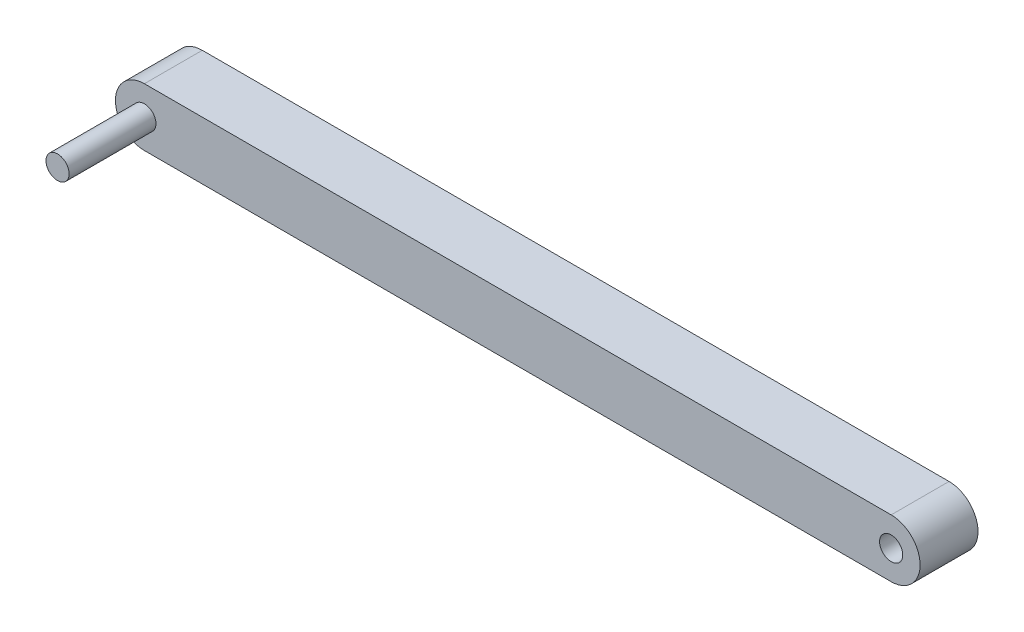
ISO-10303-21;
HEADER;
FILE_DESCRIPTION(('STEP AP214'),'2;1');
FILE_NAME('part.step','',(''),(''),'','','');
FILE_SCHEMA(('AUTOMOTIVE_DESIGN { 1 0 10303 214 1 1 1 1 }'));
ENDSEC;
DATA;
#1=APPLICATION_CONTEXT('core data for automotive mechanical design processes');
#2=APPLICATION_PROTOCOL_DEFINITION('international standard','automotive_design',2000,#1);
#3=PRODUCT_CONTEXT('',#1,'mechanical');
#4=PRODUCT('Part','Part','',(#3));
#5=PRODUCT_RELATED_PRODUCT_CATEGORY('part','',(#4));
#6=PRODUCT_DEFINITION_FORMATION('','',#4);
#7=PRODUCT_DEFINITION_CONTEXT('part definition',#1,'design');
#8=PRODUCT_DEFINITION('design','',#6,#7);
#9=PRODUCT_DEFINITION_SHAPE('','',#8);
#10=(LENGTH_UNIT() NAMED_UNIT(*) SI_UNIT(.MILLI.,.METRE.));
#11=(NAMED_UNIT(*) PLANE_ANGLE_UNIT() SI_UNIT($,.RADIAN.));
#12=(NAMED_UNIT(*) SI_UNIT($,.STERADIAN.) SOLID_ANGLE_UNIT());
#13=UNCERTAINTY_MEASURE_WITH_UNIT(LENGTH_MEASURE(1.E-05),#10,'distance_accuracy_value','');
#14=(GEOMETRIC_REPRESENTATION_CONTEXT(3) GLOBAL_UNCERTAINTY_ASSIGNED_CONTEXT((#13)) GLOBAL_UNIT_ASSIGNED_CONTEXT((#10,
#11,#12)) REPRESENTATION_CONTEXT('',''));
#15=CARTESIAN_POINT('',(0.,0.,0.));
#16=DIRECTION('',(0.,0.,1.));
#17=DIRECTION('',(1.,0.,0.));
#18=AXIS2_PLACEMENT_3D('',#15,#16,#17);
#19=CARTESIAN_POINT('',(0.,50.,100.));
#20=DIRECTION('',(0.,0.,-1.));
#21=DIRECTION('',(-1.,0.,0.));
#22=AXIS2_PLACEMENT_3D('',#19,#20,#21);
#23=CYLINDRICAL_SURFACE('',#22,50.);
#24=CARTESIAN_POINT('',(0.,50.,0.));
#25=DIRECTION('',(0.,0.,1.));
#26=DIRECTION('',(1.,0.,0.));
#27=AXIS2_PLACEMENT_3D('',#24,#25,#26);
#28=CIRCLE('',#27,50.);
#29=CARTESIAN_POINT('',(0.,0.,0.));
#30=VERTEX_POINT('',#29);
#31=CARTESIAN_POINT('',(0.,100.,0.));
#32=VERTEX_POINT('',#31);
#33=EDGE_CURVE('E108',#30,#32,#28,.F.);
#34=ORIENTED_EDGE('',*,*,#33,.F.);
#35=DIRECTION('',(0.,0.,-1.));
#36=VECTOR('',#35,1.);
#37=CARTESIAN_POINT('',(0.,0.,100.));
#38=LINE('',#37,#36);
#39=CARTESIAN_POINT('',(0.,0.,100.));
#40=VERTEX_POINT('',#39);
#41=EDGE_CURVE('E11',#40,#30,#38,.T.);
#42=ORIENTED_EDGE('',*,*,#41,.F.);
#43=CARTESIAN_POINT('',(0.,50.,100.));
#44=DIRECTION('',(0.,0.,1.));
#45=DIRECTION('',(1.,0.,0.));
#46=AXIS2_PLACEMENT_3D('',#43,#44,#45);
#47=CIRCLE('',#46,50.);
#48=CARTESIAN_POINT('',(0.,100.,100.));
#49=VERTEX_POINT('',#48);
#50=EDGE_CURVE('E92',#40,#49,#47,.F.);
#51=ORIENTED_EDGE('',*,*,#50,.T.);
#52=DIRECTION('',(0.,0.,-1.));
#53=VECTOR('',#52,1.);
#54=CARTESIAN_POINT('',(0.,100.,100.));
#55=LINE('',#54,#53);
#56=EDGE_CURVE('E81',#49,#32,#55,.T.);
#57=ORIENTED_EDGE('',*,*,#56,.T.);
#58=EDGE_LOOP('',(#34,#42,#51,#57));
#59=FACE_BOUND('',#58,.T.);
#60=ADVANCED_FACE('F41',(#59),#23,.T.);
#61=CARTESIAN_POINT('',(0.,0.,100.));
#62=DIRECTION('',(0.,1.,0.));
#63=DIRECTION('',(0.,0.,1.));
#64=AXIS2_PLACEMENT_3D('',#61,#62,#63);
#65=PLANE('',#64);
#66=DIRECTION('',(1.,0.,0.));
#67=VECTOR('',#66,1.);
#68=CARTESIAN_POINT('',(0.,0.,0.));
#69=LINE('',#68,#67);
#70=CARTESIAN_POINT('',(1290.,0.,0.));
#71=VERTEX_POINT('',#70);
#72=EDGE_CURVE('E98',#30,#71,#69,.T.);
#73=ORIENTED_EDGE('',*,*,#72,.T.);
#74=DIRECTION('',(0.,0.,-1.));
#75=VECTOR('',#74,1.);
#76=CARTESIAN_POINT('',(1290.,0.,100.));
#77=LINE('',#76,#75);
#78=CARTESIAN_POINT('',(1290.,0.,100.));
#79=VERTEX_POINT('',#78);
#80=EDGE_CURVE('E50',#79,#71,#77,.T.);
#81=ORIENTED_EDGE('',*,*,#80,.F.);
#82=DIRECTION('',(1.,0.,0.));
#83=VECTOR('',#82,1.);
#84=CARTESIAN_POINT('',(0.,0.,100.));
#85=LINE('',#84,#83);
#86=EDGE_CURVE('E87',#40,#79,#85,.T.);
#87=ORIENTED_EDGE('',*,*,#86,.F.);
#88=ORIENTED_EDGE('',*,*,#41,.T.);
#89=EDGE_LOOP('',(#73,#81,#87,#88));
#90=FACE_BOUND('',#89,.T.);
#91=ADVANCED_FACE('F96',(#90),#65,.F.);
#92=CARTESIAN_POINT('',(1290.,50.0000000000001,100.));
#93=DIRECTION('',(0.,0.,-1.));
#94=DIRECTION('',(-1.,0.,0.));
#95=AXIS2_PLACEMENT_3D('',#92,#93,#94);
#96=CYLINDRICAL_SURFACE('',#95,50.0000000000001);
#97=CARTESIAN_POINT('',(1290.,50.0000000000001,0.));
#98=DIRECTION('',(0.,0.,1.));
#99=DIRECTION('',(1.,0.,0.));
#100=AXIS2_PLACEMENT_3D('',#97,#98,#99);
#101=CIRCLE('',#100,50.0000000000001);
#102=CARTESIAN_POINT('',(1290.,100.,0.));
#103=VERTEX_POINT('',#102);
#104=EDGE_CURVE('E74',#71,#103,#101,.T.);
#105=ORIENTED_EDGE('',*,*,#104,.T.);
#106=DIRECTION('',(0.,0.,-1.));
#107=VECTOR('',#106,1.);
#108=CARTESIAN_POINT('',(1290.,100.,100.));
#109=LINE('',#108,#107);
#110=CARTESIAN_POINT('',(1290.,100.,100.));
#111=VERTEX_POINT('',#110);
#112=EDGE_CURVE('E100',#111,#103,#109,.T.);
#113=ORIENTED_EDGE('',*,*,#112,.F.);
#114=CARTESIAN_POINT('',(1290.,50.0000000000001,100.));
#115=DIRECTION('',(0.,0.,1.));
#116=DIRECTION('',(1.,0.,0.));
#117=AXIS2_PLACEMENT_3D('',#114,#115,#116);
#118=CIRCLE('',#117,50.0000000000001);
#119=EDGE_CURVE('E91',#79,#111,#118,.T.);
#120=ORIENTED_EDGE('',*,*,#119,.F.);
#121=ORIENTED_EDGE('',*,*,#80,.T.);
#122=EDGE_LOOP('',(#105,#113,#120,#121));
#123=FACE_BOUND('',#122,.T.);
#124=ADVANCED_FACE('F101',(#123),#96,.T.);
#125=CARTESIAN_POINT('',(0.,100.,100.));
#126=DIRECTION('',(0.,-1.,0.));
#127=DIRECTION('',(1.,0.,0.));
#128=AXIS2_PLACEMENT_3D('',#125,#126,#127);
#129=PLANE('',#128);
#130=DIRECTION('',(-1.,0.,0.));
#131=VECTOR('',#130,1.);
#132=CARTESIAN_POINT('',(0.,100.,0.));
#133=LINE('',#132,#131);
#134=EDGE_CURVE('E117',#103,#32,#133,.T.);
#135=ORIENTED_EDGE('',*,*,#134,.T.);
#136=ORIENTED_EDGE('',*,*,#56,.F.);
#137=DIRECTION('',(-1.,0.,0.));
#138=VECTOR('',#137,1.);
#139=CARTESIAN_POINT('',(0.,100.,100.));
#140=LINE('',#139,#138);
#141=EDGE_CURVE('E58',#111,#49,#140,.T.);
#142=ORIENTED_EDGE('',*,*,#141,.F.);
#143=ORIENTED_EDGE('',*,*,#112,.T.);
#144=EDGE_LOOP('',(#135,#136,#142,#143));
#145=FACE_BOUND('',#144,.T.);
#146=ADVANCED_FACE('F125',(#145),#129,.F.);
#147=CARTESIAN_POINT('',(0.,0.,100.));
#148=DIRECTION('',(0.,0.,1.));
#149=DIRECTION('',(1.,0.,0.));
#150=AXIS2_PLACEMENT_3D('',#147,#148,#149);
#151=PLANE('',#150);
#152=CARTESIAN_POINT('',(0.,50.,100.));
#153=DIRECTION('',(0.,0.,1.));
#154=DIRECTION('',(1.,0.,0.));
#155=AXIS2_PLACEMENT_3D('',#152,#153,#154);
#156=CIRCLE('',#155,20.);
#157=CARTESIAN_POINT('',(20.,50.,100.));
#158=VERTEX_POINT('',#157);
#159=EDGE_CURVE('E163',#158,#158,#156,.T.);
#160=ORIENTED_EDGE('',*,*,#159,.F.);
#161=EDGE_LOOP('',(#160));
#162=FACE_BOUND('',#161,.T.);
#163=CARTESIAN_POINT('',(1290.,50.0000000000001,100.));
#164=DIRECTION('',(0.,0.,1.));
#165=DIRECTION('',(1.,0.,0.));
#166=AXIS2_PLACEMENT_3D('',#163,#164,#165);
#167=CIRCLE('',#166,20.);
#168=CARTESIAN_POINT('',(1310.,50.0000000000001,100.));
#169=VERTEX_POINT('',#168);
#170=EDGE_CURVE('E162',#169,#169,#167,.T.);
#171=ORIENTED_EDGE('',*,*,#170,.F.);
#172=EDGE_LOOP('',(#171));
#173=FACE_BOUND('',#172,.T.);
#174=ORIENTED_EDGE('',*,*,#50,.F.);
#175=ORIENTED_EDGE('',*,*,#86,.T.);
#176=ORIENTED_EDGE('',*,*,#119,.T.);
#177=ORIENTED_EDGE('',*,*,#141,.T.);
#178=EDGE_LOOP('',(#174,#175,#176,#177));
#179=FACE_BOUND('',#178,.T.);
#180=ADVANCED_FACE('F89',(#162,#173,#179),#151,.T.);
#181=CARTESIAN_POINT('',(0.,0.,0.));
#182=DIRECTION('',(0.,0.,1.));
#183=DIRECTION('',(1.,0.,0.));
#184=AXIS2_PLACEMENT_3D('',#181,#182,#183);
#185=PLANE('',#184);
#186=CARTESIAN_POINT('',(1290.,50.0000000000001,0.));
#187=DIRECTION('',(0.,0.,1.));
#188=DIRECTION('',(1.,0.,0.));
#189=AXIS2_PLACEMENT_3D('',#186,#187,#188);
#190=CIRCLE('',#189,20.);
#191=CARTESIAN_POINT('',(1310.,50.0000000000001,0.));
#192=VERTEX_POINT('',#191);
#193=EDGE_CURVE('E112',#192,#192,#190,.T.);
#194=ORIENTED_EDGE('',*,*,#193,.T.);
#195=EDGE_LOOP('',(#194));
#196=FACE_BOUND('',#195,.T.);
#197=ORIENTED_EDGE('',*,*,#33,.T.);
#198=ORIENTED_EDGE('',*,*,#134,.F.);
#199=ORIENTED_EDGE('',*,*,#104,.F.);
#200=ORIENTED_EDGE('',*,*,#72,.F.);
#201=EDGE_LOOP('',(#197,#198,#199,#200));
#202=FACE_BOUND('',#201,.T.);
#203=ADVANCED_FACE('F127',(#196,#202),#185,.F.);
#204=CARTESIAN_POINT('',(1290.,50.0000000000001,0.));
#205=DIRECTION('',(0.,0.,1.));
#206=DIRECTION('',(1.,0.,0.));
#207=AXIS2_PLACEMENT_3D('',#204,#205,#206);
#208=CYLINDRICAL_SURFACE('',#207,20.);
#209=ORIENTED_EDGE('',*,*,#193,.F.);
#210=EDGE_LOOP('',(#209));
#211=FACE_BOUND('',#210,.T.);
#212=ORIENTED_EDGE('',*,*,#170,.T.);
#213=EDGE_LOOP('',(#212));
#214=FACE_BOUND('',#213,.T.);
#215=ADVANCED_FACE('F141',(#211,#214),#208,.F.);
#216=CARTESIAN_POINT('',(0.,50.,250.));
#217=DIRECTION('',(0.,0.,-1.));
#218=DIRECTION('',(-1.,0.,0.));
#219=AXIS2_PLACEMENT_3D('',#216,#217,#218);
#220=CYLINDRICAL_SURFACE('',#219,20.);
#221=CARTESIAN_POINT('',(0.,50.,250.));
#222=DIRECTION('',(0.,0.,1.));
#223=DIRECTION('',(1.,0.,0.));
#224=AXIS2_PLACEMENT_3D('',#221,#222,#223);
#225=CIRCLE('',#224,20.);
#226=CARTESIAN_POINT('',(20.,50.,250.));
#227=VERTEX_POINT('',#226);
#228=EDGE_CURVE('E160',#227,#227,#225,.T.);
#229=ORIENTED_EDGE('',*,*,#228,.F.);
#230=EDGE_LOOP('',(#229));
#231=FACE_BOUND('',#230,.T.);
#232=ORIENTED_EDGE('',*,*,#159,.T.);
#233=EDGE_LOOP('',(#232));
#234=FACE_BOUND('',#233,.T.);
#235=ADVANCED_FACE('F148',(#231,#234),#220,.T.);
#236=CARTESIAN_POINT('',(0.,50.,250.));
#237=DIRECTION('',(0.,0.,1.));
#238=DIRECTION('',(1.,0.,0.));
#239=AXIS2_PLACEMENT_3D('',#236,#237,#238);
#240=PLANE('',#239);
#241=ORIENTED_EDGE('',*,*,#228,.T.);
#242=EDGE_LOOP('',(#241));
#243=FACE_BOUND('',#242,.T.);
#244=ADVANCED_FACE('F152',(#243),#240,.T.);
#245=CLOSED_SHELL('',(#60,#91,#124,#146,#180,#203,#215,#235,#244));
#246=MANIFOLD_SOLID_BREP('B2',#245);
#247=ADVANCED_BREP_SHAPE_REPRESENTATION('',(#18,#246),#14);
#248=SHAPE_DEFINITION_REPRESENTATION(#9,#247);
ENDSEC;
END-ISO-10303-21;
